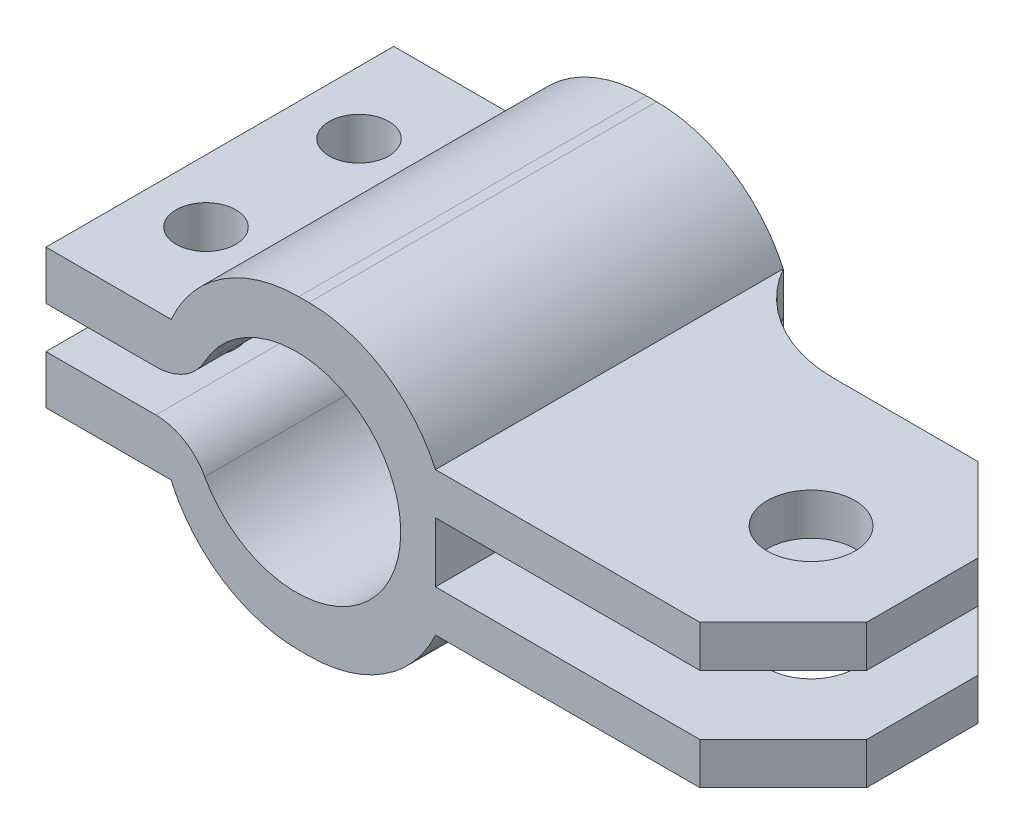
ISO-10303-21;
HEADER;
FILE_DESCRIPTION(('STEP AP214'),'2;1');
FILE_NAME('part.step','',(''),(''),'','','');
FILE_SCHEMA(('AUTOMOTIVE_DESIGN { 1 0 10303 214 1 1 1 1 }'));
ENDSEC;
DATA;
#1=APPLICATION_CONTEXT('core data for automotive mechanical design processes');
#2=APPLICATION_PROTOCOL_DEFINITION('international standard','automotive_design',2000,#1);
#3=PRODUCT_CONTEXT('',#1,'mechanical');
#4=PRODUCT('Part','Part','',(#3));
#5=PRODUCT_RELATED_PRODUCT_CATEGORY('part','',(#4));
#6=PRODUCT_DEFINITION_FORMATION('','',#4);
#7=PRODUCT_DEFINITION_CONTEXT('part definition',#1,'design');
#8=PRODUCT_DEFINITION('design','',#6,#7);
#9=PRODUCT_DEFINITION_SHAPE('','',#8);
#10=(LENGTH_UNIT() NAMED_UNIT(*) SI_UNIT(.MILLI.,.METRE.));
#11=(NAMED_UNIT(*) PLANE_ANGLE_UNIT() SI_UNIT($,.RADIAN.));
#12=(NAMED_UNIT(*) SI_UNIT($,.STERADIAN.) SOLID_ANGLE_UNIT());
#13=UNCERTAINTY_MEASURE_WITH_UNIT(LENGTH_MEASURE(1.E-05),#10,'distance_accuracy_value','');
#14=(GEOMETRIC_REPRESENTATION_CONTEXT(3) GLOBAL_UNCERTAINTY_ASSIGNED_CONTEXT((#13)) GLOBAL_UNIT_ASSIGNED_CONTEXT((#10,
#11,#12)) REPRESENTATION_CONTEXT('',''));
#15=CARTESIAN_POINT('',(0.,0.,0.));
#16=DIRECTION('',(0.,0.,1.));
#17=DIRECTION('',(1.,0.,0.));
#18=AXIS2_PLACEMENT_3D('',#15,#16,#17);
#19=CARTESIAN_POINT('',(12.5,-11.,25.));
#20=DIRECTION('',(-1.,0.,0.));
#21=DIRECTION('',(0.,0.,1.));
#22=AXIS2_PLACEMENT_3D('',#19,#20,#21);
#23=PLANE('',#22);
#24=DIRECTION('',(0.,0.,1.));
#25=VECTOR('',#24,1.);
#26=CARTESIAN_POINT('',(12.5,-2.15,25.));
#27=LINE('',#26,#25);
#28=CARTESIAN_POINT('',(12.5,-2.15,0.));
#29=VERTEX_POINT('',#28);
#30=CARTESIAN_POINT('',(12.5,-2.15,25.));
#31=VERTEX_POINT('',#30);
#32=EDGE_CURVE('E310',#29,#31,#27,.T.);
#33=ORIENTED_EDGE('',*,*,#32,.F.);
#34=DIRECTION('',(0.,1.,0.));
#35=VECTOR('',#34,1.);
#36=CARTESIAN_POINT('',(12.5,-11.,0.));
#37=LINE('',#36,#35);
#38=CARTESIAN_POINT('',(12.5,2.15,0.));
#39=VERTEX_POINT('',#38);
#40=EDGE_CURVE('E366',#29,#39,#37,.T.);
#41=ORIENTED_EDGE('',*,*,#40,.T.);
#42=DIRECTION('',(0.,0.,-1.));
#43=VECTOR('',#42,1.);
#44=CARTESIAN_POINT('',(12.5,2.15,25.));
#45=LINE('',#44,#43);
#46=CARTESIAN_POINT('',(12.5,2.15,25.));
#47=VERTEX_POINT('',#46);
#48=EDGE_CURVE('E325',#47,#39,#45,.T.);
#49=ORIENTED_EDGE('',*,*,#48,.F.);
#50=DIRECTION('',(0.,1.,0.));
#51=VECTOR('',#50,1.);
#52=CARTESIAN_POINT('',(12.5,-11.,25.));
#53=LINE('',#52,#51);
#54=EDGE_CURVE('E354',#31,#47,#53,.T.);
#55=ORIENTED_EDGE('',*,*,#54,.F.);
#56=EDGE_LOOP('',(#33,#41,#49,#55));
#57=FACE_BOUND('',#56,.T.);
#58=ADVANCED_FACE('F38',(#57),#23,.F.);
#59=CARTESIAN_POINT('',(0.,0.,25.));
#60=DIRECTION('',(0.,0.,1.));
#61=DIRECTION('',(1.,0.,0.));
#62=AXIS2_PLACEMENT_3D('',#59,#60,#61);
#63=PLANE('',#62);
#64=DIRECTION('',(-1.,0.,0.));
#65=VECTOR('',#64,1.);
#66=CARTESIAN_POINT('',(37.5,2.15,25.));
#67=LINE('',#66,#65);
#68=CARTESIAN_POINT('',(31.5,2.15,25.));
#69=VERTEX_POINT('',#68);
#70=EDGE_CURVE('E342',#69,#47,#67,.T.);
#71=ORIENTED_EDGE('',*,*,#70,.F.);
#72=DIRECTION('',(0.,1.,0.));
#73=VECTOR('',#72,1.);
#74=CARTESIAN_POINT('',(31.5,0.,25.));
#75=LINE('',#74,#73);
#76=CARTESIAN_POINT('',(31.5,5.15,25.));
#77=VERTEX_POINT('',#76);
#78=EDGE_CURVE('E11',#69,#77,#75,.T.);
#79=ORIENTED_EDGE('',*,*,#78,.T.);
#80=DIRECTION('',(-1.,0.,0.));
#81=VECTOR('',#80,1.);
#82=CARTESIAN_POINT('',(37.5,5.15,25.));
#83=LINE('',#82,#81);
#84=CARTESIAN_POINT('',(12.5,5.15,25.));
#85=VERTEX_POINT('',#84);
#86=EDGE_CURVE('E333',#77,#85,#83,.T.);
#87=ORIENTED_EDGE('',*,*,#86,.T.);
#88=CARTESIAN_POINT('',(3.40178588952754,1.,25.));
#89=DIRECTION('',(0.,0.,1.));
#90=DIRECTION('',(1.,0.,0.));
#91=AXIS2_PLACEMENT_3D('',#88,#89,#90);
#92=CIRCLE('',#91,10.);
#93=CARTESIAN_POINT('',(3.40178588952754,11.,25.));
#94=VERTEX_POINT('',#93);
#95=EDGE_CURVE('E413',#85,#94,#92,.T.);
#96=ORIENTED_EDGE('',*,*,#95,.T.);
#97=DIRECTION('',(-1.,0.,0.));
#98=VECTOR('',#97,1.);
#99=CARTESIAN_POINT('',(12.5,11.,25.));
#100=LINE('',#99,#98);
#101=CARTESIAN_POINT('',(2.66515138991167,11.,25.));
#102=VERTEX_POINT('',#101);
#103=EDGE_CURVE('E358',#94,#102,#100,.T.);
#104=ORIENTED_EDGE('',*,*,#103,.T.);
#105=CARTESIAN_POINT('',(2.66515138991168,1.,25.));
#106=DIRECTION('',(0.,0.,1.));
#107=DIRECTION('',(1.,0.,0.));
#108=AXIS2_PLACEMENT_3D('',#105,#106,#107);
#109=CIRCLE('',#108,10.);
#110=CARTESIAN_POINT('',(-6.50000000000001,5.,25.));
#111=VERTEX_POINT('',#110);
#112=EDGE_CURVE('E396',#102,#111,#109,.T.);
#113=ORIENTED_EDGE('',*,*,#112,.T.);
#114=DIRECTION('',(-1.,0.,0.));
#115=VECTOR('',#114,1.);
#116=CARTESIAN_POINT('',(-12.5,5.,25.));
#117=LINE('',#116,#115);
#118=CARTESIAN_POINT('',(-15.5,5.,25.));
#119=VERTEX_POINT('',#118);
#120=EDGE_CURVE('E281',#111,#119,#117,.T.);
#121=ORIENTED_EDGE('',*,*,#120,.T.);
#122=DIRECTION('',(0.,1.,0.));
#123=VECTOR('',#122,1.);
#124=CARTESIAN_POINT('',(-15.5,1.5,25.));
#125=LINE('',#124,#123);
#126=CARTESIAN_POINT('',(-15.5,1.5,25.));
#127=VERTEX_POINT('',#126);
#128=EDGE_CURVE('E272',#127,#119,#125,.T.);
#129=ORIENTED_EDGE('',*,*,#128,.F.);
#130=DIRECTION('',(1.,0.,0.));
#131=VECTOR('',#130,1.);
#132=CARTESIAN_POINT('',(-23.3579813214323,1.5,25.));
#133=LINE('',#132,#131);
#134=CARTESIAN_POINT('',(-7.59950493836208,1.5,25.));
#135=VERTEX_POINT('',#134);
#136=EDGE_CURVE('E237',#127,#135,#133,.T.);
#137=ORIENTED_EDGE('',*,*,#136,.T.);
#138=CARTESIAN_POINT('',(-7.59950493836208,5.5,25.));
#139=DIRECTION('',(0.,0.,1.));
#140=DIRECTION('',(1.,0.,0.));
#141=AXIS2_PLACEMENT_3D('',#138,#139,#140);
#142=CIRCLE('',#141,4.);
#143=CARTESIAN_POINT('',(-4.08663365545353,3.58695652173913,25.));
#144=VERTEX_POINT('',#143);
#145=EDGE_CURVE('E427',#135,#144,#142,.T.);
#146=ORIENTED_EDGE('',*,*,#145,.T.);
#147=CARTESIAN_POINT('',(2.5,0.,25.));
#148=DIRECTION('',(0.,0.,1.));
#149=DIRECTION('',(1.,0.,0.));
#150=AXIS2_PLACEMENT_3D('',#147,#148,#149);
#151=CIRCLE('',#150,7.5);
#152=CARTESIAN_POINT('',(-4.08663365545353,-3.58695652173913,25.));
#153=VERTEX_POINT('',#152);
#154=EDGE_CURVE('E345',#153,#144,#151,.T.);
#155=ORIENTED_EDGE('',*,*,#154,.F.);
#156=CARTESIAN_POINT('',(-7.59950493836208,-5.5,25.));
#157=DIRECTION('',(0.,0.,1.));
#158=DIRECTION('',(1.,0.,0.));
#159=AXIS2_PLACEMENT_3D('',#156,#157,#158);
#160=CIRCLE('',#159,4.);
#161=CARTESIAN_POINT('',(-7.59950493836208,-1.5,25.));
#162=VERTEX_POINT('',#161);
#163=EDGE_CURVE('E233',#153,#162,#160,.T.);
#164=ORIENTED_EDGE('',*,*,#163,.T.);
#165=DIRECTION('',(-1.,0.,0.));
#166=VECTOR('',#165,1.);
#167=CARTESIAN_POINT('',(-23.3579813214323,-1.5,25.));
#168=LINE('',#167,#166);
#169=CARTESIAN_POINT('',(-15.5,-1.5,25.));
#170=VERTEX_POINT('',#169);
#171=EDGE_CURVE('E224',#162,#170,#168,.T.);
#172=ORIENTED_EDGE('',*,*,#171,.T.);
#173=DIRECTION('',(0.,1.,0.));
#174=VECTOR('',#173,1.);
#175=CARTESIAN_POINT('',(-15.5,-5.,25.));
#176=LINE('',#175,#174);
#177=CARTESIAN_POINT('',(-15.5,-5.,25.));
#178=VERTEX_POINT('',#177);
#179=EDGE_CURVE('E230',#178,#170,#176,.T.);
#180=ORIENTED_EDGE('',*,*,#179,.F.);
#181=DIRECTION('',(1.,0.,0.));
#182=VECTOR('',#181,1.);
#183=CARTESIAN_POINT('',(-12.5,-5.,25.));
#184=LINE('',#183,#182);
#185=CARTESIAN_POINT('',(-6.50000000000001,-5.,25.));
#186=VERTEX_POINT('',#185);
#187=EDGE_CURVE('E290',#178,#186,#184,.T.);
#188=ORIENTED_EDGE('',*,*,#187,.T.);
#189=CARTESIAN_POINT('',(2.66515138991167,-0.999999999999999,25.));
#190=DIRECTION('',(0.,0.,1.));
#191=DIRECTION('',(1.,0.,0.));
#192=AXIS2_PLACEMENT_3D('',#189,#190,#191);
#193=CIRCLE('',#192,10.);
#194=CARTESIAN_POINT('',(2.66515138991167,-11.,25.));
#195=VERTEX_POINT('',#194);
#196=EDGE_CURVE('E398',#186,#195,#193,.T.);
#197=ORIENTED_EDGE('',*,*,#196,.T.);
#198=DIRECTION('',(1.,0.,0.));
#199=VECTOR('',#198,1.);
#200=CARTESIAN_POINT('',(12.5,-11.,25.));
#201=LINE('',#200,#199);
#202=CARTESIAN_POINT('',(3.40178588952755,-11.,25.));
#203=VERTEX_POINT('',#202);
#204=EDGE_CURVE('E351',#195,#203,#201,.T.);
#205=ORIENTED_EDGE('',*,*,#204,.T.);
#206=CARTESIAN_POINT('',(3.40178588952755,-0.999999999999999,25.));
#207=DIRECTION('',(0.,0.,1.));
#208=DIRECTION('',(1.,0.,0.));
#209=AXIS2_PLACEMENT_3D('',#206,#207,#208);
#210=CIRCLE('',#209,10.);
#211=CARTESIAN_POINT('',(12.5,-5.15,25.));
#212=VERTEX_POINT('',#211);
#213=EDGE_CURVE('E410',#203,#212,#210,.T.);
#214=ORIENTED_EDGE('',*,*,#213,.T.);
#215=DIRECTION('',(-1.,0.,0.));
#216=VECTOR('',#215,1.);
#217=CARTESIAN_POINT('',(37.5,-5.15,25.));
#218=LINE('',#217,#216);
#219=CARTESIAN_POINT('',(31.5,-5.15,25.));
#220=VERTEX_POINT('',#219);
#221=EDGE_CURVE('E323',#220,#212,#218,.T.);
#222=ORIENTED_EDGE('',*,*,#221,.F.);
#223=DIRECTION('',(0.,1.,0.));
#224=VECTOR('',#223,1.);
#225=CARTESIAN_POINT('',(31.5,0.,25.));
#226=LINE('',#225,#224);
#227=CARTESIAN_POINT('',(31.5,-2.15,25.));
#228=VERTEX_POINT('',#227);
#229=EDGE_CURVE('E47',#220,#228,#226,.T.);
#230=ORIENTED_EDGE('',*,*,#229,.T.);
#231=DIRECTION('',(-1.,0.,0.));
#232=VECTOR('',#231,1.);
#233=CARTESIAN_POINT('',(37.5,-2.15,25.));
#234=LINE('',#233,#232);
#235=EDGE_CURVE('E313',#228,#31,#234,.T.);
#236=ORIENTED_EDGE('',*,*,#235,.T.);
#237=ORIENTED_EDGE('',*,*,#54,.T.);
#238=EDGE_LOOP('',(#71,#79,#87,#96,#104,#113,#121,#129,#137,#146,#155,#164,#172,#180,#188,#197,
#205,#214,#222,#230,#236,#237));
#239=FACE_BOUND('',#238,.T.);
#240=ADVANCED_FACE('F227',(#239),#63,.T.);
#241=CARTESIAN_POINT('',(0.,0.,0.));
#242=DIRECTION('',(0.,0.,1.));
#243=DIRECTION('',(1.,0.,0.));
#244=AXIS2_PLACEMENT_3D('',#241,#242,#243);
#245=PLANE('',#244);
#246=DIRECTION('',(-1.,0.,0.));
#247=VECTOR('',#246,1.);
#248=CARTESIAN_POINT('',(-23.3579813214323,-1.5,0.));
#249=LINE('',#248,#247);
#250=CARTESIAN_POINT('',(-7.59950493836208,-1.5,0.));
#251=VERTEX_POINT('',#250);
#252=CARTESIAN_POINT('',(-15.5,-1.5,0.));
#253=VERTEX_POINT('',#252);
#254=EDGE_CURVE('E244',#251,#253,#249,.T.);
#255=ORIENTED_EDGE('',*,*,#254,.F.);
#256=CARTESIAN_POINT('',(-7.59950493836208,-5.5,0.));
#257=DIRECTION('',(0.,0.,1.));
#258=DIRECTION('',(1.,0.,0.));
#259=AXIS2_PLACEMENT_3D('',#256,#257,#258);
#260=CIRCLE('',#259,4.);
#261=CARTESIAN_POINT('',(-4.08663365545353,-3.58695652173913,0.));
#262=VERTEX_POINT('',#261);
#263=EDGE_CURVE('E421',#251,#262,#260,.F.);
#264=ORIENTED_EDGE('',*,*,#263,.T.);
#265=CARTESIAN_POINT('',(2.5,0.,0.));
#266=DIRECTION('',(0.,0.,1.));
#267=DIRECTION('',(1.,0.,0.));
#268=AXIS2_PLACEMENT_3D('',#265,#266,#267);
#269=CIRCLE('',#268,7.5);
#270=CARTESIAN_POINT('',(-4.08663365545353,3.58695652173913,0.));
#271=VERTEX_POINT('',#270);
#272=EDGE_CURVE('E344',#262,#271,#269,.T.);
#273=ORIENTED_EDGE('',*,*,#272,.T.);
#274=CARTESIAN_POINT('',(-7.59950493836208,5.5,0.));
#275=DIRECTION('',(0.,0.,1.));
#276=DIRECTION('',(1.,0.,0.));
#277=AXIS2_PLACEMENT_3D('',#274,#275,#276);
#278=CIRCLE('',#277,4.);
#279=CARTESIAN_POINT('',(-7.59950493836208,1.5,0.));
#280=VERTEX_POINT('',#279);
#281=EDGE_CURVE('E419',#271,#280,#278,.F.);
#282=ORIENTED_EDGE('',*,*,#281,.T.);
#283=DIRECTION('',(1.,0.,0.));
#284=VECTOR('',#283,1.);
#285=CARTESIAN_POINT('',(-23.3579813214323,1.5,0.));
#286=LINE('',#285,#284);
#287=CARTESIAN_POINT('',(-15.5,1.5,0.));
#288=VERTEX_POINT('',#287);
#289=EDGE_CURVE('E238',#288,#280,#286,.T.);
#290=ORIENTED_EDGE('',*,*,#289,.F.);
#291=DIRECTION('',(0.,-1.,0.));
#292=VECTOR('',#291,1.);
#293=CARTESIAN_POINT('',(-15.5,5.,0.));
#294=LINE('',#293,#292);
#295=CARTESIAN_POINT('',(-15.5,5.,0.));
#296=VERTEX_POINT('',#295);
#297=EDGE_CURVE('E266',#296,#288,#294,.T.);
#298=ORIENTED_EDGE('',*,*,#297,.F.);
#299=DIRECTION('',(-1.,0.,0.));
#300=VECTOR('',#299,1.);
#301=CARTESIAN_POINT('',(-12.5,5.,0.));
#302=LINE('',#301,#300);
#303=CARTESIAN_POINT('',(-6.50000000000001,5.,0.));
#304=VERTEX_POINT('',#303);
#305=EDGE_CURVE('E284',#304,#296,#302,.T.);
#306=ORIENTED_EDGE('',*,*,#305,.F.);
#307=CARTESIAN_POINT('',(2.66515138991168,1.,0.));
#308=DIRECTION('',(0.,0.,1.));
#309=DIRECTION('',(1.,0.,0.));
#310=AXIS2_PLACEMENT_3D('',#307,#308,#309);
#311=CIRCLE('',#310,10.);
#312=CARTESIAN_POINT('',(2.66515138991167,11.,0.));
#313=VERTEX_POINT('',#312);
#314=EDGE_CURVE('E391',#304,#313,#311,.F.);
#315=ORIENTED_EDGE('',*,*,#314,.T.);
#316=DIRECTION('',(-1.,0.,0.));
#317=VECTOR('',#316,1.);
#318=CARTESIAN_POINT('',(12.5,11.,0.));
#319=LINE('',#318,#317);
#320=CARTESIAN_POINT('',(3.40178588952754,11.,0.));
#321=VERTEX_POINT('',#320);
#322=EDGE_CURVE('E355',#321,#313,#319,.T.);
#323=ORIENTED_EDGE('',*,*,#322,.F.);
#324=CARTESIAN_POINT('',(3.40178588952754,1.,0.));
#325=DIRECTION('',(0.,0.,1.));
#326=DIRECTION('',(1.,0.,0.));
#327=AXIS2_PLACEMENT_3D('',#324,#325,#326);
#328=CIRCLE('',#327,10.);
#329=CARTESIAN_POINT('',(12.5,5.15,0.));
#330=VERTEX_POINT('',#329);
#331=EDGE_CURVE('E408',#321,#330,#328,.F.);
#332=ORIENTED_EDGE('',*,*,#331,.T.);
#333=EDGE_CURVE('E363',#39,#330,#37,.T.);
#334=ORIENTED_EDGE('',*,*,#333,.F.);
#335=ORIENTED_EDGE('',*,*,#40,.F.);
#336=CARTESIAN_POINT('',(12.5,-5.15,0.));
#337=VERTEX_POINT('',#336);
#338=EDGE_CURVE('E367',#337,#29,#37,.T.);
#339=ORIENTED_EDGE('',*,*,#338,.F.);
#340=CARTESIAN_POINT('',(3.40178588952755,-0.999999999999999,0.));
#341=DIRECTION('',(0.,0.,1.));
#342=DIRECTION('',(1.,0.,0.));
#343=AXIS2_PLACEMENT_3D('',#340,#341,#342);
#344=CIRCLE('',#343,10.);
#345=CARTESIAN_POINT('',(3.40178588952755,-11.,0.));
#346=VERTEX_POINT('',#345);
#347=EDGE_CURVE('E406',#337,#346,#344,.F.);
#348=ORIENTED_EDGE('',*,*,#347,.T.);
#349=DIRECTION('',(1.,0.,0.));
#350=VECTOR('',#349,1.);
#351=CARTESIAN_POINT('',(12.5,-11.,0.));
#352=LINE('',#351,#350);
#353=CARTESIAN_POINT('',(2.66515138991167,-11.,0.));
#354=VERTEX_POINT('',#353);
#355=EDGE_CURVE('E348',#354,#346,#352,.T.);
#356=ORIENTED_EDGE('',*,*,#355,.F.);
#357=CARTESIAN_POINT('',(2.66515138991167,-0.999999999999999,0.));
#358=DIRECTION('',(0.,0.,1.));
#359=DIRECTION('',(1.,0.,0.));
#360=AXIS2_PLACEMENT_3D('',#357,#358,#359);
#361=CIRCLE('',#360,10.);
#362=CARTESIAN_POINT('',(-6.50000000000001,-5.,0.));
#363=VERTEX_POINT('',#362);
#364=EDGE_CURVE('E394',#354,#363,#361,.F.);
#365=ORIENTED_EDGE('',*,*,#364,.T.);
#366=DIRECTION('',(1.,0.,0.));
#367=VECTOR('',#366,1.);
#368=CARTESIAN_POINT('',(-12.5,-5.,0.));
#369=LINE('',#368,#367);
#370=CARTESIAN_POINT('',(-15.5,-5.,0.));
#371=VERTEX_POINT('',#370);
#372=EDGE_CURVE('E277',#371,#363,#369,.T.);
#373=ORIENTED_EDGE('',*,*,#372,.F.);
#374=DIRECTION('',(0.,-1.,0.));
#375=VECTOR('',#374,1.);
#376=CARTESIAN_POINT('',(-15.5,-1.5,0.));
#377=LINE('',#376,#375);
#378=EDGE_CURVE('E248',#253,#371,#377,.T.);
#379=ORIENTED_EDGE('',*,*,#378,.F.);
#380=EDGE_LOOP('',(#255,#264,#273,#282,#290,#298,#306,#315,#323,#332,#334,#335,#339,#348,#356,
#365,#373,#379));
#381=FACE_BOUND('',#380,.T.);
#382=ADVANCED_FACE('F499',(#381),#245,.F.);
#383=CARTESIAN_POINT('',(12.5,-11.,25.));
#384=DIRECTION('',(0.,1.,0.));
#385=DIRECTION('',(-1.,0.,0.));
#386=AXIS2_PLACEMENT_3D('',#383,#384,#385);
#387=PLANE('',#386);
#388=ORIENTED_EDGE('',*,*,#355,.T.);
#389=DIRECTION('',(0.,0.,-1.));
#390=VECTOR('',#389,1.);
#391=CARTESIAN_POINT('',(3.40178588952755,-11.,25.));
#392=LINE('',#391,#390);
#393=EDGE_CURVE('E415',#346,#203,#392,.F.);
#394=ORIENTED_EDGE('',*,*,#393,.T.);
#395=ORIENTED_EDGE('',*,*,#204,.F.);
#396=DIRECTION('',(0.,0.,1.));
#397=VECTOR('',#396,1.);
#398=CARTESIAN_POINT('',(2.66515138991167,-11.,25.));
#399=LINE('',#398,#397);
#400=EDGE_CURVE('E388',#195,#354,#399,.F.);
#401=ORIENTED_EDGE('',*,*,#400,.T.);
#402=EDGE_LOOP('',(#388,#394,#395,#401));
#403=FACE_BOUND('',#402,.T.);
#404=ADVANCED_FACE('F552',(#403),#387,.F.);
#405=CARTESIAN_POINT('',(12.5,11.,25.));
#406=DIRECTION('',(0.,-1.,0.));
#407=DIRECTION('',(1.,0.,0.));
#408=AXIS2_PLACEMENT_3D('',#405,#406,#407);
#409=PLANE('',#408);
#410=ORIENTED_EDGE('',*,*,#103,.F.);
#411=DIRECTION('',(0.,0.,1.));
#412=VECTOR('',#411,1.);
#413=CARTESIAN_POINT('',(3.40178588952754,11.,25.));
#414=LINE('',#413,#412);
#415=EDGE_CURVE('E403',#94,#321,#414,.F.);
#416=ORIENTED_EDGE('',*,*,#415,.T.);
#417=ORIENTED_EDGE('',*,*,#322,.T.);
#418=DIRECTION('',(0.,0.,-1.));
#419=VECTOR('',#418,1.);
#420=CARTESIAN_POINT('',(2.66515138991167,11.,25.));
#421=LINE('',#420,#419);
#422=EDGE_CURVE('E400',#313,#102,#421,.F.);
#423=ORIENTED_EDGE('',*,*,#422,.T.);
#424=EDGE_LOOP('',(#410,#416,#417,#423));
#425=FACE_BOUND('',#424,.T.);
#426=ADVANCED_FACE('F550',(#425),#409,.F.);
#427=CARTESIAN_POINT('',(2.5,0.,25.));
#428=DIRECTION('',(0.,0.,-1.));
#429=DIRECTION('',(-1.,0.,0.));
#430=AXIS2_PLACEMENT_3D('',#427,#428,#429);
#431=CYLINDRICAL_SURFACE('',#430,7.5);
#432=ORIENTED_EDGE('',*,*,#272,.F.);
#433=DIRECTION('',(0.,0.,-1.));
#434=VECTOR('',#433,1.);
#435=CARTESIAN_POINT('',(-4.08663365545353,-3.58695652173913,25.));
#436=LINE('',#435,#434);
#437=EDGE_CURVE('E425',#262,#153,#436,.F.);
#438=ORIENTED_EDGE('',*,*,#437,.T.);
#439=ORIENTED_EDGE('',*,*,#154,.T.);
#440=DIRECTION('',(0.,0.,-1.));
#441=VECTOR('',#440,1.);
#442=CARTESIAN_POINT('',(-4.08663365545353,3.58695652173913,25.));
#443=LINE('',#442,#441);
#444=EDGE_CURVE('E423',#144,#271,#443,.T.);
#445=ORIENTED_EDGE('',*,*,#444,.T.);
#446=EDGE_LOOP('',(#432,#438,#439,#445));
#447=FACE_BOUND('',#446,.T.);
#448=ADVANCED_FACE('F539',(#447),#431,.F.);
#449=CARTESIAN_POINT('',(37.5,2.15,25.));
#450=DIRECTION('',(0.,1.,0.));
#451=DIRECTION('',(0.,0.,1.));
#452=AXIS2_PLACEMENT_3D('',#449,#450,#451);
#453=PLANE('',#452);
#454=CARTESIAN_POINT('',(29.5,2.15,15.));
#455=DIRECTION('',(0.,1.,0.));
#456=DIRECTION('',(0.,0.,1.));
#457=AXIS2_PLACEMENT_3D('',#454,#455,#456);
#458=CIRCLE('',#457,3.15);
#459=CARTESIAN_POINT('',(29.5,2.15,18.15));
#460=VERTEX_POINT('',#459);
#461=EDGE_CURVE('E302',#460,#460,#458,.T.);
#462=ORIENTED_EDGE('',*,*,#461,.T.);
#463=EDGE_LOOP('',(#462));
#464=FACE_BOUND('',#463,.T.);
#465=DIRECTION('',(-1.,0.,0.));
#466=VECTOR('',#465,1.);
#467=CARTESIAN_POINT('',(37.5,2.15,5.));
#468=LINE('',#467,#466);
#469=CARTESIAN_POINT('',(31.5,2.15,5.));
#470=VERTEX_POINT('',#469);
#471=CARTESIAN_POINT('',(21.1602540378444,2.15,5.));
#472=VERTEX_POINT('',#471);
#473=EDGE_CURVE('E340',#470,#472,#468,.T.);
#474=ORIENTED_EDGE('',*,*,#473,.F.);
#475=DIRECTION('',(0.707106781186549,0.,0.707106781186546));
#476=VECTOR('',#475,1.);
#477=CARTESIAN_POINT('',(37.5,2.15,11.));
#478=LINE('',#477,#476);
#479=CARTESIAN_POINT('',(37.5,2.15,11.));
#480=VERTEX_POINT('',#479);
#481=EDGE_CURVE('E456',#470,#480,#478,.T.);
#482=ORIENTED_EDGE('',*,*,#481,.T.);
#483=DIRECTION('',(0.,0.,-1.));
#484=VECTOR('',#483,1.);
#485=CARTESIAN_POINT('',(37.5,2.15,25.));
#486=LINE('',#485,#484);
#487=CARTESIAN_POINT('',(37.5,2.15,19.));
#488=VERTEX_POINT('',#487);
#489=EDGE_CURVE('E326',#488,#480,#486,.T.);
#490=ORIENTED_EDGE('',*,*,#489,.F.);
#491=DIRECTION('',(0.707106781186549,0.,-0.707106781186546));
#492=VECTOR('',#491,1.);
#493=CARTESIAN_POINT('',(37.5,2.15,19.));
#494=LINE('',#493,#492);
#495=EDGE_CURVE('E454',#488,#69,#494,.F.);
#496=ORIENTED_EDGE('',*,*,#495,.T.);
#497=ORIENTED_EDGE('',*,*,#70,.T.);
#498=ORIENTED_EDGE('',*,*,#48,.T.);
#499=CARTESIAN_POINT('',(21.1602540378444,2.15,-5.));
#500=DIRECTION('',(0.,1.,0.));
#501=DIRECTION('',(0.,0.,1.));
#502=AXIS2_PLACEMENT_3D('',#499,#500,#501);
#503=CIRCLE('',#502,10.);
#504=EDGE_CURVE('E385',#39,#472,#503,.T.);
#505=ORIENTED_EDGE('',*,*,#504,.T.);
#506=EDGE_LOOP('',(#474,#482,#490,#496,#497,#498,#505));
#507=FACE_BOUND('',#506,.T.);
#508=ADVANCED_FACE('F510',(#464,#507),#453,.F.);
#509=CARTESIAN_POINT('',(37.5,5.15,5.));
#510=DIRECTION('',(0.,0.,1.));
#511=DIRECTION('',(0.,-1.,0.));
#512=AXIS2_PLACEMENT_3D('',#509,#510,#511);
#513=PLANE('',#512);
#514=DIRECTION('',(-1.,0.,0.));
#515=VECTOR('',#514,1.);
#516=CARTESIAN_POINT('',(37.5,5.15,5.));
#517=LINE('',#516,#515);
#518=CARTESIAN_POINT('',(31.5,5.15,5.));
#519=VERTEX_POINT('',#518);
#520=CARTESIAN_POINT('',(21.1602540378444,5.15,5.));
#521=VERTEX_POINT('',#520);
#522=EDGE_CURVE('E338',#519,#521,#517,.T.);
#523=ORIENTED_EDGE('',*,*,#522,.F.);
#524=DIRECTION('',(0.,-1.,0.));
#525=VECTOR('',#524,1.);
#526=CARTESIAN_POINT('',(31.5,2.15,5.));
#527=LINE('',#526,#525);
#528=EDGE_CURVE('E452',#519,#470,#527,.T.);
#529=ORIENTED_EDGE('',*,*,#528,.T.);
#530=ORIENTED_EDGE('',*,*,#473,.T.);
#531=DIRECTION('',(0.,1.,0.));
#532=VECTOR('',#531,1.);
#533=CARTESIAN_POINT('',(21.1602540378444,5.15,5.));
#534=LINE('',#533,#532);
#535=EDGE_CURVE('E373',#472,#521,#534,.T.);
#536=ORIENTED_EDGE('',*,*,#535,.T.);
#537=EDGE_LOOP('',(#523,#529,#530,#536));
#538=FACE_BOUND('',#537,.T.);
#539=ADVANCED_FACE('F530',(#538),#513,.F.);
#540=CARTESIAN_POINT('',(37.5,5.15,25.));
#541=DIRECTION('',(0.,-1.,0.));
#542=DIRECTION('',(0.,0.,-1.));
#543=AXIS2_PLACEMENT_3D('',#540,#541,#542);
#544=PLANE('',#543);
#545=CARTESIAN_POINT('',(29.5,5.15,15.));
#546=DIRECTION('',(0.,1.,0.));
#547=DIRECTION('',(0.,0.,1.));
#548=AXIS2_PLACEMENT_3D('',#545,#546,#547);
#549=CIRCLE('',#548,3.15);
#550=CARTESIAN_POINT('',(29.5,5.15,18.15));
#551=VERTEX_POINT('',#550);
#552=EDGE_CURVE('E289',#551,#551,#549,.T.);
#553=ORIENTED_EDGE('',*,*,#552,.F.);
#554=EDGE_LOOP('',(#553));
#555=FACE_BOUND('',#554,.T.);
#556=DIRECTION('',(0.,0.,1.));
#557=VECTOR('',#556,1.);
#558=CARTESIAN_POINT('',(37.5,5.15,25.));
#559=LINE('',#558,#557);
#560=CARTESIAN_POINT('',(37.5,5.15,11.));
#561=VERTEX_POINT('',#560);
#562=CARTESIAN_POINT('',(37.5,5.15,19.));
#563=VERTEX_POINT('',#562);
#564=EDGE_CURVE('E329',#561,#563,#559,.T.);
#565=ORIENTED_EDGE('',*,*,#564,.F.);
#566=DIRECTION('',(-0.707106781186549,0.,-0.707106781186546));
#567=VECTOR('',#566,1.);
#568=CARTESIAN_POINT('',(37.5,5.15,11.));
#569=LINE('',#568,#567);
#570=EDGE_CURVE('E450',#561,#519,#569,.T.);
#571=ORIENTED_EDGE('',*,*,#570,.T.);
#572=ORIENTED_EDGE('',*,*,#522,.T.);
#573=CARTESIAN_POINT('',(21.1602540378444,5.15,-5.));
#574=DIRECTION('',(0.,-1.,0.));
#575=DIRECTION('',(0.,0.,-1.));
#576=AXIS2_PLACEMENT_3D('',#573,#574,#575);
#577=CIRCLE('',#576,10.);
#578=EDGE_CURVE('E382',#521,#330,#577,.T.);
#579=ORIENTED_EDGE('',*,*,#578,.T.);
#580=DIRECTION('',(0.,0.,1.));
#581=VECTOR('',#580,1.);
#582=CARTESIAN_POINT('',(12.5,5.15,25.));
#583=LINE('',#582,#581);
#584=EDGE_CURVE('E330',#330,#85,#583,.T.);
#585=ORIENTED_EDGE('',*,*,#584,.T.);
#586=ORIENTED_EDGE('',*,*,#86,.F.);
#587=DIRECTION('',(-0.707106781186549,0.,0.707106781186546));
#588=VECTOR('',#587,1.);
#589=CARTESIAN_POINT('',(37.5,5.15,19.));
#590=LINE('',#589,#588);
#591=EDGE_CURVE('E448',#77,#563,#590,.F.);
#592=ORIENTED_EDGE('',*,*,#591,.T.);
#593=EDGE_LOOP('',(#565,#571,#572,#579,#585,#586,#592));
#594=FACE_BOUND('',#593,.T.);
#595=ADVANCED_FACE('F521',(#555,#594),#544,.F.);
#596=CARTESIAN_POINT('',(37.5,0.,0.));
#597=DIRECTION('',(1.,0.,0.));
#598=DIRECTION('',(0.,0.,-1.));
#599=AXIS2_PLACEMENT_3D('',#596,#597,#598);
#600=PLANE('',#599);
#601=ORIENTED_EDGE('',*,*,#489,.T.);
#602=DIRECTION('',(0.,1.,0.));
#603=VECTOR('',#602,1.);
#604=CARTESIAN_POINT('',(37.5,5.15,11.));
#605=LINE('',#604,#603);
#606=EDGE_CURVE('E445',#480,#561,#605,.T.);
#607=ORIENTED_EDGE('',*,*,#606,.T.);
#608=ORIENTED_EDGE('',*,*,#564,.T.);
#609=DIRECTION('',(0.,-1.,0.));
#610=VECTOR('',#609,1.);
#611=CARTESIAN_POINT('',(37.5,0.,19.));
#612=LINE('',#611,#610);
#613=EDGE_CURVE('E433',#563,#488,#612,.T.);
#614=ORIENTED_EDGE('',*,*,#613,.T.);
#615=EDGE_LOOP('',(#601,#607,#608,#614));
#616=FACE_BOUND('',#615,.T.);
#617=ADVANCED_FACE('F523',(#616),#600,.T.);
#618=CARTESIAN_POINT('',(37.5,-5.15,25.));
#619=DIRECTION('',(0.,1.,0.));
#620=DIRECTION('',(0.,0.,1.));
#621=AXIS2_PLACEMENT_3D('',#618,#619,#620);
#622=PLANE('',#621);
#623=CARTESIAN_POINT('',(29.5,-5.15,15.));
#624=DIRECTION('',(0.,1.,0.));
#625=DIRECTION('',(0.,0.,1.));
#626=AXIS2_PLACEMENT_3D('',#623,#624,#625);
#627=CIRCLE('',#626,3.15);
#628=CARTESIAN_POINT('',(29.5,-5.15,18.15));
#629=VERTEX_POINT('',#628);
#630=EDGE_CURVE('E299',#629,#629,#627,.T.);
#631=ORIENTED_EDGE('',*,*,#630,.T.);
#632=EDGE_LOOP('',(#631));
#633=FACE_BOUND('',#632,.T.);
#634=DIRECTION('',(-1.,0.,0.));
#635=VECTOR('',#634,1.);
#636=CARTESIAN_POINT('',(37.5,-5.15,5.));
#637=LINE('',#636,#635);
#638=CARTESIAN_POINT('',(31.5,-5.15,5.));
#639=VERTEX_POINT('',#638);
#640=CARTESIAN_POINT('',(21.1602540378444,-5.15,5.));
#641=VERTEX_POINT('',#640);
#642=EDGE_CURVE('E321',#639,#641,#637,.T.);
#643=ORIENTED_EDGE('',*,*,#642,.F.);
#644=DIRECTION('',(0.707106781186549,0.,0.707106781186546));
#645=VECTOR('',#644,1.);
#646=CARTESIAN_POINT('',(37.5,-5.15,11.));
#647=LINE('',#646,#645);
#648=CARTESIAN_POINT('',(37.5,-5.15,11.));
#649=VERTEX_POINT('',#648);
#650=EDGE_CURVE('E470',#639,#649,#647,.T.);
#651=ORIENTED_EDGE('',*,*,#650,.T.);
#652=DIRECTION('',(0.,0.,-1.));
#653=VECTOR('',#652,1.);
#654=CARTESIAN_POINT('',(37.5,-5.15,25.));
#655=LINE('',#654,#653);
#656=CARTESIAN_POINT('',(37.5,-5.15,19.));
#657=VERTEX_POINT('',#656);
#658=EDGE_CURVE('E306',#657,#649,#655,.T.);
#659=ORIENTED_EDGE('',*,*,#658,.F.);
#660=DIRECTION('',(0.707106781186549,0.,-0.707106781186546));
#661=VECTOR('',#660,1.);
#662=CARTESIAN_POINT('',(37.5,-5.15,19.));
#663=LINE('',#662,#661);
#664=EDGE_CURVE('E54',#657,#220,#663,.F.);
#665=ORIENTED_EDGE('',*,*,#664,.T.);
#666=ORIENTED_EDGE('',*,*,#221,.T.);
#667=DIRECTION('',(0.,0.,-1.));
#668=VECTOR('',#667,1.);
#669=CARTESIAN_POINT('',(12.5,-5.15,25.));
#670=LINE('',#669,#668);
#671=EDGE_CURVE('E305',#212,#337,#670,.T.);
#672=ORIENTED_EDGE('',*,*,#671,.T.);
#673=CARTESIAN_POINT('',(21.1602540378444,-5.15,-5.));
#674=DIRECTION('',(0.,1.,0.));
#675=DIRECTION('',(0.,0.,1.));
#676=AXIS2_PLACEMENT_3D('',#673,#674,#675);
#677=CIRCLE('',#676,10.);
#678=EDGE_CURVE('E379',#337,#641,#677,.T.);
#679=ORIENTED_EDGE('',*,*,#678,.T.);
#680=EDGE_LOOP('',(#643,#651,#659,#665,#666,#672,#679));
#681=FACE_BOUND('',#680,.T.);
#682=ADVANCED_FACE('F483',(#633,#681),#622,.F.);
#683=CARTESIAN_POINT('',(37.5,-2.15,5.));
#684=DIRECTION('',(0.,0.,1.));
#685=DIRECTION('',(1.,0.,0.));
#686=AXIS2_PLACEMENT_3D('',#683,#684,#685);
#687=PLANE('',#686);
#688=DIRECTION('',(-1.,0.,0.));
#689=VECTOR('',#688,1.);
#690=CARTESIAN_POINT('',(37.5,-2.15,5.));
#691=LINE('',#690,#689);
#692=CARTESIAN_POINT('',(31.5,-2.15,5.));
#693=VERTEX_POINT('',#692);
#694=CARTESIAN_POINT('',(21.1602540378444,-2.15,5.));
#695=VERTEX_POINT('',#694);
#696=EDGE_CURVE('E319',#693,#695,#691,.T.);
#697=ORIENTED_EDGE('',*,*,#696,.F.);
#698=DIRECTION('',(0.,-1.,0.));
#699=VECTOR('',#698,1.);
#700=CARTESIAN_POINT('',(31.5,-5.15,5.));
#701=LINE('',#700,#699);
#702=EDGE_CURVE('E62',#693,#639,#701,.T.);
#703=ORIENTED_EDGE('',*,*,#702,.T.);
#704=ORIENTED_EDGE('',*,*,#642,.T.);
#705=DIRECTION('',(0.,1.,0.));
#706=VECTOR('',#705,1.);
#707=CARTESIAN_POINT('',(21.1602540378444,-2.15,5.));
#708=LINE('',#707,#706);
#709=EDGE_CURVE('E360',#641,#695,#708,.T.);
#710=ORIENTED_EDGE('',*,*,#709,.T.);
#711=EDGE_LOOP('',(#697,#703,#704,#710));
#712=FACE_BOUND('',#711,.T.);
#713=ADVANCED_FACE('F488',(#712),#687,.F.);
#714=CARTESIAN_POINT('',(37.5,-2.15,25.));
#715=DIRECTION('',(0.,-1.,0.));
#716=DIRECTION('',(0.,0.,-1.));
#717=AXIS2_PLACEMENT_3D('',#714,#715,#716);
#718=PLANE('',#717);
#719=CARTESIAN_POINT('',(29.5,-2.15,15.));
#720=DIRECTION('',(0.,-1.,0.));
#721=DIRECTION('',(0.,0.,-1.));
#722=AXIS2_PLACEMENT_3D('',#719,#720,#721);
#723=CIRCLE('',#722,3.15);
#724=CARTESIAN_POINT('',(29.5,-2.15,11.85));
#725=VERTEX_POINT('',#724);
#726=EDGE_CURVE('E298',#725,#725,#723,.T.);
#727=ORIENTED_EDGE('',*,*,#726,.T.);
#728=EDGE_LOOP('',(#727));
#729=FACE_BOUND('',#728,.T.);
#730=DIRECTION('',(0.,0.,1.));
#731=VECTOR('',#730,1.);
#732=CARTESIAN_POINT('',(37.5,-2.15,25.));
#733=LINE('',#732,#731);
#734=CARTESIAN_POINT('',(37.5,-2.15,11.));
#735=VERTEX_POINT('',#734);
#736=CARTESIAN_POINT('',(37.5,-2.15,19.));
#737=VERTEX_POINT('',#736);
#738=EDGE_CURVE('E309',#735,#737,#733,.T.);
#739=ORIENTED_EDGE('',*,*,#738,.F.);
#740=DIRECTION('',(-0.707106781186549,0.,-0.707106781186546));
#741=VECTOR('',#740,1.);
#742=CARTESIAN_POINT('',(37.5,-2.15,11.));
#743=LINE('',#742,#741);
#744=EDGE_CURVE('E466',#735,#693,#743,.T.);
#745=ORIENTED_EDGE('',*,*,#744,.T.);
#746=ORIENTED_EDGE('',*,*,#696,.T.);
#747=CARTESIAN_POINT('',(21.1602540378444,-2.15,-5.));
#748=DIRECTION('',(0.,-1.,0.));
#749=DIRECTION('',(0.,0.,-1.));
#750=AXIS2_PLACEMENT_3D('',#747,#748,#749);
#751=CIRCLE('',#750,10.);
#752=EDGE_CURVE('E376',#695,#29,#751,.T.);
#753=ORIENTED_EDGE('',*,*,#752,.T.);
#754=ORIENTED_EDGE('',*,*,#32,.T.);
#755=ORIENTED_EDGE('',*,*,#235,.F.);
#756=DIRECTION('',(-0.707106781186549,0.,0.707106781186546));
#757=VECTOR('',#756,1.);
#758=CARTESIAN_POINT('',(37.5,-2.15,19.));
#759=LINE('',#758,#757);
#760=EDGE_CURVE('E464',#228,#737,#759,.F.);
#761=ORIENTED_EDGE('',*,*,#760,.T.);
#762=EDGE_LOOP('',(#739,#745,#746,#753,#754,#755,#761));
#763=FACE_BOUND('',#762,.T.);
#764=ADVANCED_FACE('F477',(#729,#763),#718,.F.);
#765=CARTESIAN_POINT('',(37.5,0.,0.));
#766=DIRECTION('',(1.,0.,0.));
#767=DIRECTION('',(0.,0.,-1.));
#768=AXIS2_PLACEMENT_3D('',#765,#766,#767);
#769=PLANE('',#768);
#770=ORIENTED_EDGE('',*,*,#658,.T.);
#771=DIRECTION('',(0.,1.,0.));
#772=VECTOR('',#771,1.);
#773=CARTESIAN_POINT('',(37.5,-2.15,11.));
#774=LINE('',#773,#772);
#775=EDGE_CURVE('E461',#649,#735,#774,.T.);
#776=ORIENTED_EDGE('',*,*,#775,.T.);
#777=ORIENTED_EDGE('',*,*,#738,.T.);
#778=DIRECTION('',(0.,-1.,0.));
#779=VECTOR('',#778,1.);
#780=CARTESIAN_POINT('',(37.5,0.,19.));
#781=LINE('',#780,#779);
#782=EDGE_CURVE('E458',#737,#657,#781,.T.);
#783=ORIENTED_EDGE('',*,*,#782,.T.);
#784=EDGE_LOOP('',(#770,#776,#777,#783));
#785=FACE_BOUND('',#784,.T.);
#786=ADVANCED_FACE('F481',(#785),#769,.T.);
#787=CARTESIAN_POINT('',(29.5,-19.85,15.));
#788=DIRECTION('',(0.,1.,0.));
#789=DIRECTION('',(0.,0.,1.));
#790=AXIS2_PLACEMENT_3D('',#787,#788,#789);
#791=CYLINDRICAL_SURFACE('',#790,3.15);
#792=ORIENTED_EDGE('',*,*,#726,.F.);
#793=EDGE_LOOP('',(#792));
#794=FACE_BOUND('',#793,.T.);
#795=ORIENTED_EDGE('',*,*,#630,.F.);
#796=EDGE_LOOP('',(#795));
#797=FACE_BOUND('',#796,.T.);
#798=ADVANCED_FACE('F635',(#794,#797),#791,.F.);
#799=ORIENTED_EDGE('',*,*,#552,.T.);
#800=EDGE_LOOP('',(#799));
#801=FACE_BOUND('',#800,.T.);
#802=ORIENTED_EDGE('',*,*,#461,.F.);
#803=EDGE_LOOP('',(#802));
#804=FACE_BOUND('',#803,.T.);
#805=ADVANCED_FACE('F558',(#801,#804),#791,.F.);
#806=CARTESIAN_POINT('',(21.1602540378444,-11.,-5.));
#807=DIRECTION('',(0.,1.,0.));
#808=DIRECTION('',(0.,0.,1.));
#809=AXIS2_PLACEMENT_3D('',#806,#807,#808);
#810=CYLINDRICAL_SURFACE('',#809,10.);
#811=ORIENTED_EDGE('',*,*,#678,.F.);
#812=ORIENTED_EDGE('',*,*,#338,.T.);
#813=ORIENTED_EDGE('',*,*,#752,.F.);
#814=ORIENTED_EDGE('',*,*,#709,.F.);
#815=EDGE_LOOP('',(#811,#812,#813,#814));
#816=FACE_BOUND('',#815,.T.);
#817=ADVANCED_FACE('F492',(#816),#810,.F.);
#818=CARTESIAN_POINT('',(21.1602540378444,-11.,-5.));
#819=DIRECTION('',(0.,1.,0.));
#820=DIRECTION('',(0.,0.,1.));
#821=AXIS2_PLACEMENT_3D('',#818,#819,#820);
#822=CYLINDRICAL_SURFACE('',#821,10.);
#823=ORIENTED_EDGE('',*,*,#504,.F.);
#824=ORIENTED_EDGE('',*,*,#333,.T.);
#825=ORIENTED_EDGE('',*,*,#578,.F.);
#826=ORIENTED_EDGE('',*,*,#535,.F.);
#827=EDGE_LOOP('',(#823,#824,#825,#826));
#828=FACE_BOUND('',#827,.T.);
#829=ADVANCED_FACE('F505',(#828),#822,.F.);
#830=CARTESIAN_POINT('',(-12.5,5.,25.));
#831=DIRECTION('',(0.,-1.,0.));
#832=DIRECTION('',(1.,0.,0.));
#833=AXIS2_PLACEMENT_3D('',#830,#831,#832);
#834=PLANE('',#833);
#835=CARTESIAN_POINT('',(-11.,5.,7.));
#836=DIRECTION('',(0.,1.,0.));
#837=DIRECTION('',(-1.,0.,0.));
#838=AXIS2_PLACEMENT_3D('',#835,#836,#837);
#839=CIRCLE('',#838,2.15);
#840=CARTESIAN_POINT('',(-13.15,5.,7.));
#841=VERTEX_POINT('',#840);
#842=EDGE_CURVE('E438',#841,#841,#839,.T.);
#843=ORIENTED_EDGE('',*,*,#842,.F.);
#844=EDGE_LOOP('',(#843));
#845=FACE_BOUND('',#844,.T.);
#846=CARTESIAN_POINT('',(-11.,5.,18.));
#847=DIRECTION('',(0.,1.,0.));
#848=DIRECTION('',(-1.,0.,0.));
#849=AXIS2_PLACEMENT_3D('',#846,#847,#848);
#850=CIRCLE('',#849,2.15);
#851=CARTESIAN_POINT('',(-13.15,5.,18.));
#852=VERTEX_POINT('',#851);
#853=EDGE_CURVE('E951',#852,#852,#850,.T.);
#854=ORIENTED_EDGE('',*,*,#853,.F.);
#855=EDGE_LOOP('',(#854));
#856=FACE_BOUND('',#855,.T.);
#857=ORIENTED_EDGE('',*,*,#305,.T.);
#858=DIRECTION('',(0.,0.,-1.));
#859=VECTOR('',#858,1.);
#860=CARTESIAN_POINT('',(-15.5,5.,25.));
#861=LINE('',#860,#859);
#862=EDGE_CURVE('E263',#119,#296,#861,.T.);
#863=ORIENTED_EDGE('',*,*,#862,.F.);
#864=ORIENTED_EDGE('',*,*,#120,.F.);
#865=DIRECTION('',(0.,0.,-1.));
#866=VECTOR('',#865,1.);
#867=CARTESIAN_POINT('',(-6.50000000000001,5.,25.));
#868=LINE('',#867,#866);
#869=EDGE_CURVE('E283',#111,#304,#868,.T.);
#870=ORIENTED_EDGE('',*,*,#869,.T.);
#871=EDGE_LOOP('',(#857,#863,#864,#870));
#872=FACE_BOUND('',#871,.T.);
#873=ADVANCED_FACE('F561',(#845,#856,#872),#834,.F.);
#874=CARTESIAN_POINT('',(-12.5,-5.,25.));
#875=DIRECTION('',(0.,1.,0.));
#876=DIRECTION('',(-1.,0.,0.));
#877=AXIS2_PLACEMENT_3D('',#874,#875,#876);
#878=PLANE('',#877);
#879=CARTESIAN_POINT('',(-11.,-5.,7.));
#880=DIRECTION('',(0.,1.,0.));
#881=DIRECTION('',(-1.,0.,0.));
#882=AXIS2_PLACEMENT_3D('',#879,#880,#881);
#883=CIRCLE('',#882,2.15);
#884=CARTESIAN_POINT('',(-13.15,-5.,7.));
#885=VERTEX_POINT('',#884);
#886=EDGE_CURVE('E254',#885,#885,#883,.T.);
#887=ORIENTED_EDGE('',*,*,#886,.T.);
#888=EDGE_LOOP('',(#887));
#889=FACE_BOUND('',#888,.T.);
#890=CARTESIAN_POINT('',(-11.,-5.,18.));
#891=DIRECTION('',(0.,1.,0.));
#892=DIRECTION('',(-1.,0.,0.));
#893=AXIS2_PLACEMENT_3D('',#890,#891,#892);
#894=CIRCLE('',#893,2.15);
#895=CARTESIAN_POINT('',(-13.15,-5.,18.));
#896=VERTEX_POINT('',#895);
#897=EDGE_CURVE('E442',#896,#896,#894,.T.);
#898=ORIENTED_EDGE('',*,*,#897,.T.);
#899=EDGE_LOOP('',(#898));
#900=FACE_BOUND('',#899,.T.);
#901=ORIENTED_EDGE('',*,*,#372,.T.);
#902=DIRECTION('',(0.,0.,-1.));
#903=VECTOR('',#902,1.);
#904=CARTESIAN_POINT('',(-6.50000000000001,-5.,25.));
#905=LINE('',#904,#903);
#906=EDGE_CURVE('E286',#186,#363,#905,.T.);
#907=ORIENTED_EDGE('',*,*,#906,.F.);
#908=ORIENTED_EDGE('',*,*,#187,.F.);
#909=DIRECTION('',(0.,0.,1.));
#910=VECTOR('',#909,1.);
#911=CARTESIAN_POINT('',(-15.5,-5.,0.));
#912=LINE('',#911,#910);
#913=EDGE_CURVE('E253',#371,#178,#912,.T.);
#914=ORIENTED_EDGE('',*,*,#913,.F.);
#915=EDGE_LOOP('',(#901,#907,#908,#914));
#916=FACE_BOUND('',#915,.T.);
#917=ADVANCED_FACE('F566',(#889,#900,#916),#878,.F.);
#918=CARTESIAN_POINT('',(2.66515138991167,-0.999999999999999,25.));
#919=DIRECTION('',(0.,0.,1.));
#920=DIRECTION('',(1.,0.,0.));
#921=AXIS2_PLACEMENT_3D('',#918,#919,#920);
#922=CYLINDRICAL_SURFACE('',#921,10.);
#923=ORIENTED_EDGE('',*,*,#196,.F.);
#924=ORIENTED_EDGE('',*,*,#906,.T.);
#925=ORIENTED_EDGE('',*,*,#364,.F.);
#926=ORIENTED_EDGE('',*,*,#400,.F.);
#927=EDGE_LOOP('',(#923,#924,#925,#926));
#928=FACE_BOUND('',#927,.T.);
#929=ADVANCED_FACE('F562',(#928),#922,.T.);
#930=CARTESIAN_POINT('',(2.66515138991168,1.,25.));
#931=DIRECTION('',(0.,0.,-1.));
#932=DIRECTION('',(-1.,0.,0.));
#933=AXIS2_PLACEMENT_3D('',#930,#931,#932);
#934=CYLINDRICAL_SURFACE('',#933,10.);
#935=ORIENTED_EDGE('',*,*,#112,.F.);
#936=ORIENTED_EDGE('',*,*,#422,.F.);
#937=ORIENTED_EDGE('',*,*,#314,.F.);
#938=ORIENTED_EDGE('',*,*,#869,.F.);
#939=EDGE_LOOP('',(#935,#936,#937,#938));
#940=FACE_BOUND('',#939,.T.);
#941=ADVANCED_FACE('F565',(#940),#934,.T.);
#942=CARTESIAN_POINT('',(3.40178588952754,1.,25.));
#943=DIRECTION('',(0.,0.,1.));
#944=DIRECTION('',(1.,0.,0.));
#945=AXIS2_PLACEMENT_3D('',#942,#943,#944);
#946=CYLINDRICAL_SURFACE('',#945,10.);
#947=ORIENTED_EDGE('',*,*,#95,.F.);
#948=ORIENTED_EDGE('',*,*,#584,.F.);
#949=ORIENTED_EDGE('',*,*,#331,.F.);
#950=ORIENTED_EDGE('',*,*,#415,.F.);
#951=EDGE_LOOP('',(#947,#948,#949,#950));
#952=FACE_BOUND('',#951,.T.);
#953=ADVANCED_FACE('F570',(#952),#946,.T.);
#954=CARTESIAN_POINT('',(3.40178588952755,-0.999999999999999,25.));
#955=DIRECTION('',(0.,0.,-1.));
#956=DIRECTION('',(-1.,0.,0.));
#957=AXIS2_PLACEMENT_3D('',#954,#955,#956);
#958=CYLINDRICAL_SURFACE('',#957,10.);
#959=ORIENTED_EDGE('',*,*,#213,.F.);
#960=ORIENTED_EDGE('',*,*,#393,.F.);
#961=ORIENTED_EDGE('',*,*,#347,.F.);
#962=ORIENTED_EDGE('',*,*,#671,.F.);
#963=EDGE_LOOP('',(#959,#960,#961,#962));
#964=FACE_BOUND('',#963,.T.);
#965=ADVANCED_FACE('F574',(#964),#958,.T.);
#966=CARTESIAN_POINT('',(-23.3579813214323,-1.5,25.));
#967=DIRECTION('',(0.,-1.,0.));
#968=DIRECTION('',(1.,0.,0.));
#969=AXIS2_PLACEMENT_3D('',#966,#967,#968);
#970=PLANE('',#969);
#971=CARTESIAN_POINT('',(-11.,-1.5,7.));
#972=DIRECTION('',(0.,-1.,0.));
#973=DIRECTION('',(1.,0.,0.));
#974=AXIS2_PLACEMENT_3D('',#971,#972,#973);
#975=CIRCLE('',#974,2.15);
#976=CARTESIAN_POINT('',(-8.85000000000001,-1.5,7.));
#977=VERTEX_POINT('',#976);
#978=EDGE_CURVE('E257',#977,#977,#975,.T.);
#979=ORIENTED_EDGE('',*,*,#978,.T.);
#980=EDGE_LOOP('',(#979));
#981=FACE_BOUND('',#980,.T.);
#982=CARTESIAN_POINT('',(-11.,-1.5,18.));
#983=DIRECTION('',(0.,-1.,0.));
#984=DIRECTION('',(1.,0.,0.));
#985=AXIS2_PLACEMENT_3D('',#982,#983,#984);
#986=CIRCLE('',#985,2.15);
#987=CARTESIAN_POINT('',(-8.85000000000001,-1.5,18.));
#988=VERTEX_POINT('',#987);
#989=EDGE_CURVE('E437',#988,#988,#986,.T.);
#990=ORIENTED_EDGE('',*,*,#989,.T.);
#991=EDGE_LOOP('',(#990));
#992=FACE_BOUND('',#991,.T.);
#993=ORIENTED_EDGE('',*,*,#171,.F.);
#994=DIRECTION('',(0.,0.,1.));
#995=VECTOR('',#994,1.);
#996=CARTESIAN_POINT('',(-7.59950493836208,-1.5,0.));
#997=LINE('',#996,#995);
#998=EDGE_CURVE('E417',#162,#251,#997,.F.);
#999=ORIENTED_EDGE('',*,*,#998,.T.);
#1000=ORIENTED_EDGE('',*,*,#254,.T.);
#1001=DIRECTION('',(0.,0.,-1.));
#1002=VECTOR('',#1001,1.);
#1003=CARTESIAN_POINT('',(-15.5,-1.5,25.));
#1004=LINE('',#1003,#1002);
#1005=EDGE_CURVE('E241',#170,#253,#1004,.T.);
#1006=ORIENTED_EDGE('',*,*,#1005,.F.);
#1007=EDGE_LOOP('',(#993,#999,#1000,#1006));
#1008=FACE_BOUND('',#1007,.T.);
#1009=ADVANCED_FACE('F242',(#981,#992,#1008),#970,.F.);
#1010=CARTESIAN_POINT('',(-23.3579813214323,1.5,25.));
#1011=DIRECTION('',(0.,1.,0.));
#1012=DIRECTION('',(-1.,0.,0.));
#1013=AXIS2_PLACEMENT_3D('',#1010,#1011,#1012);
#1014=PLANE('',#1013);
#1015=CARTESIAN_POINT('',(-11.,1.5,7.));
#1016=DIRECTION('',(0.,1.,0.));
#1017=DIRECTION('',(-1.,0.,0.));
#1018=AXIS2_PLACEMENT_3D('',#1015,#1016,#1017);
#1019=CIRCLE('',#1018,2.15);
#1020=CARTESIAN_POINT('',(-13.15,1.5,7.));
#1021=VERTEX_POINT('',#1020);
#1022=EDGE_CURVE('E439',#1021,#1021,#1019,.T.);
#1023=ORIENTED_EDGE('',*,*,#1022,.T.);
#1024=EDGE_LOOP('',(#1023));
#1025=FACE_BOUND('',#1024,.T.);
#1026=CARTESIAN_POINT('',(-11.,1.5,18.));
#1027=DIRECTION('',(0.,1.,0.));
#1028=DIRECTION('',(-1.,0.,0.));
#1029=AXIS2_PLACEMENT_3D('',#1026,#1027,#1028);
#1030=CIRCLE('',#1029,2.15);
#1031=CARTESIAN_POINT('',(-13.15,1.5,18.));
#1032=VERTEX_POINT('',#1031);
#1033=EDGE_CURVE('E434',#1032,#1032,#1030,.T.);
#1034=ORIENTED_EDGE('',*,*,#1033,.T.);
#1035=EDGE_LOOP('',(#1034));
#1036=FACE_BOUND('',#1035,.T.);
#1037=ORIENTED_EDGE('',*,*,#289,.T.);
#1038=DIRECTION('',(0.,0.,1.));
#1039=VECTOR('',#1038,1.);
#1040=CARTESIAN_POINT('',(-7.59950493836208,1.5,25.));
#1041=LINE('',#1040,#1039);
#1042=EDGE_CURVE('E430',#280,#135,#1041,.T.);
#1043=ORIENTED_EDGE('',*,*,#1042,.T.);
#1044=ORIENTED_EDGE('',*,*,#136,.F.);
#1045=DIRECTION('',(0.,0.,1.));
#1046=VECTOR('',#1045,1.);
#1047=CARTESIAN_POINT('',(-15.5,1.5,0.));
#1048=LINE('',#1047,#1046);
#1049=EDGE_CURVE('E269',#288,#127,#1048,.T.);
#1050=ORIENTED_EDGE('',*,*,#1049,.F.);
#1051=EDGE_LOOP('',(#1037,#1043,#1044,#1050));
#1052=FACE_BOUND('',#1051,.T.);
#1053=ADVANCED_FACE('F583',(#1025,#1036,#1052),#1014,.F.);
#1054=CARTESIAN_POINT('',(-7.59950493836208,-5.5,25.));
#1055=DIRECTION('',(0.,0.,-1.));
#1056=DIRECTION('',(-1.,0.,0.));
#1057=AXIS2_PLACEMENT_3D('',#1054,#1055,#1056);
#1058=CYLINDRICAL_SURFACE('',#1057,4.);
#1059=ORIENTED_EDGE('',*,*,#163,.F.);
#1060=ORIENTED_EDGE('',*,*,#437,.F.);
#1061=ORIENTED_EDGE('',*,*,#263,.F.);
#1062=ORIENTED_EDGE('',*,*,#998,.F.);
#1063=EDGE_LOOP('',(#1059,#1060,#1061,#1062));
#1064=FACE_BOUND('',#1063,.T.);
#1065=ADVANCED_FACE('F579',(#1064),#1058,.T.);
#1066=CARTESIAN_POINT('',(-7.59950493836208,5.5,25.));
#1067=DIRECTION('',(0.,0.,-1.));
#1068=DIRECTION('',(-1.,0.,0.));
#1069=AXIS2_PLACEMENT_3D('',#1066,#1067,#1068);
#1070=CYLINDRICAL_SURFACE('',#1069,4.);
#1071=ORIENTED_EDGE('',*,*,#281,.F.);
#1072=ORIENTED_EDGE('',*,*,#444,.F.);
#1073=ORIENTED_EDGE('',*,*,#145,.F.);
#1074=ORIENTED_EDGE('',*,*,#1042,.F.);
#1075=EDGE_LOOP('',(#1071,#1072,#1073,#1074));
#1076=FACE_BOUND('',#1075,.T.);
#1077=ADVANCED_FACE('F582',(#1076),#1070,.T.);
#1078=CARTESIAN_POINT('',(-15.5,0.,0.));
#1079=DIRECTION('',(-1.,0.,0.));
#1080=DIRECTION('',(0.,0.,1.));
#1081=AXIS2_PLACEMENT_3D('',#1078,#1079,#1080);
#1082=PLANE('',#1081);
#1083=ORIENTED_EDGE('',*,*,#862,.T.);
#1084=ORIENTED_EDGE('',*,*,#297,.T.);
#1085=ORIENTED_EDGE('',*,*,#1049,.T.);
#1086=ORIENTED_EDGE('',*,*,#128,.T.);
#1087=EDGE_LOOP('',(#1083,#1084,#1085,#1086));
#1088=FACE_BOUND('',#1087,.T.);
#1089=ADVANCED_FACE('F587',(#1088),#1082,.T.);
#1090=CARTESIAN_POINT('',(-15.5,0.,0.));
#1091=DIRECTION('',(-1.,0.,0.));
#1092=DIRECTION('',(0.,0.,1.));
#1093=AXIS2_PLACEMENT_3D('',#1090,#1091,#1092);
#1094=PLANE('',#1093);
#1095=ORIENTED_EDGE('',*,*,#179,.T.);
#1096=ORIENTED_EDGE('',*,*,#1005,.T.);
#1097=ORIENTED_EDGE('',*,*,#378,.T.);
#1098=ORIENTED_EDGE('',*,*,#913,.T.);
#1099=EDGE_LOOP('',(#1095,#1096,#1097,#1098));
#1100=FACE_BOUND('',#1099,.T.);
#1101=ADVANCED_FACE('F251',(#1100),#1094,.T.);
#1102=CARTESIAN_POINT('',(-11.,-20.,18.));
#1103=DIRECTION('',(0.,1.,0.));
#1104=DIRECTION('',(-1.,0.,0.));
#1105=AXIS2_PLACEMENT_3D('',#1102,#1103,#1104);
#1106=CYLINDRICAL_SURFACE('',#1105,2.15);
#1107=ORIENTED_EDGE('',*,*,#853,.T.);
#1108=EDGE_LOOP('',(#1107));
#1109=FACE_BOUND('',#1108,.T.);
#1110=ORIENTED_EDGE('',*,*,#1033,.F.);
#1111=EDGE_LOOP('',(#1110));
#1112=FACE_BOUND('',#1111,.T.);
#1113=ADVANCED_FACE('F718',(#1109,#1112),#1106,.F.);
#1114=CARTESIAN_POINT('',(-11.,-20.,7.));
#1115=DIRECTION('',(0.,1.,0.));
#1116=DIRECTION('',(-1.,0.,0.));
#1117=AXIS2_PLACEMENT_3D('',#1114,#1115,#1116);
#1118=CYLINDRICAL_SURFACE('',#1117,2.15);
#1119=ORIENTED_EDGE('',*,*,#842,.T.);
#1120=EDGE_LOOP('',(#1119));
#1121=FACE_BOUND('',#1120,.T.);
#1122=ORIENTED_EDGE('',*,*,#1022,.F.);
#1123=EDGE_LOOP('',(#1122));
#1124=FACE_BOUND('',#1123,.T.);
#1125=ADVANCED_FACE('F708',(#1121,#1124),#1118,.F.);
#1126=ORIENTED_EDGE('',*,*,#989,.F.);
#1127=EDGE_LOOP('',(#1126));
#1128=FACE_BOUND('',#1127,.T.);
#1129=ORIENTED_EDGE('',*,*,#897,.F.);
#1130=EDGE_LOOP('',(#1129));
#1131=FACE_BOUND('',#1130,.T.);
#1132=ADVANCED_FACE('F705',(#1128,#1131),#1106,.F.);
#1133=ORIENTED_EDGE('',*,*,#978,.F.);
#1134=EDGE_LOOP('',(#1133));
#1135=FACE_BOUND('',#1134,.T.);
#1136=ORIENTED_EDGE('',*,*,#886,.F.);
#1137=EDGE_LOOP('',(#1136));
#1138=FACE_BOUND('',#1137,.T.);
#1139=ADVANCED_FACE('F595',(#1135,#1138),#1118,.F.);
#1140=CARTESIAN_POINT('',(37.5,0.,11.));
#1141=DIRECTION('',(0.707106781186546,0.,-0.707106781186549));
#1142=DIRECTION('',(0.,-1.,0.));
#1143=AXIS2_PLACEMENT_3D('',#1140,#1141,#1142);
#1144=PLANE('',#1143);
#1145=ORIENTED_EDGE('',*,*,#481,.F.);
#1146=ORIENTED_EDGE('',*,*,#528,.F.);
#1147=ORIENTED_EDGE('',*,*,#570,.F.);
#1148=ORIENTED_EDGE('',*,*,#606,.F.);
#1149=EDGE_LOOP('',(#1145,#1146,#1147,#1148));
#1150=FACE_BOUND('',#1149,.T.);
#1151=ADVANCED_FACE('F526',(#1150),#1144,.T.);
#1152=CARTESIAN_POINT('',(37.5,0.,11.));
#1153=DIRECTION('',(0.707106781186546,0.,-0.707106781186549));
#1154=DIRECTION('',(0.,-1.,0.));
#1155=AXIS2_PLACEMENT_3D('',#1152,#1153,#1154);
#1156=PLANE('',#1155);
#1157=ORIENTED_EDGE('',*,*,#650,.F.);
#1158=ORIENTED_EDGE('',*,*,#702,.F.);
#1159=ORIENTED_EDGE('',*,*,#744,.F.);
#1160=ORIENTED_EDGE('',*,*,#775,.F.);
#1161=EDGE_LOOP('',(#1157,#1158,#1159,#1160));
#1162=FACE_BOUND('',#1161,.T.);
#1163=ADVANCED_FACE('F486',(#1162),#1156,.T.);
#1164=CARTESIAN_POINT('',(37.5,0.,19.));
#1165=DIRECTION('',(-0.707106781186546,0.,-0.707106781186549));
#1166=DIRECTION('',(0.,-1.,0.));
#1167=AXIS2_PLACEMENT_3D('',#1164,#1165,#1166);
#1168=PLANE('',#1167);
#1169=ORIENTED_EDGE('',*,*,#591,.F.);
#1170=ORIENTED_EDGE('',*,*,#78,.F.);
#1171=ORIENTED_EDGE('',*,*,#495,.F.);
#1172=ORIENTED_EDGE('',*,*,#613,.F.);
#1173=EDGE_LOOP('',(#1169,#1170,#1171,#1172));
#1174=FACE_BOUND('',#1173,.T.);
#1175=ADVANCED_FACE('F517',(#1174),#1168,.F.);
#1176=CARTESIAN_POINT('',(37.5,0.,19.));
#1177=DIRECTION('',(-0.707106781186546,0.,-0.707106781186549));
#1178=DIRECTION('',(0.,-1.,0.));
#1179=AXIS2_PLACEMENT_3D('',#1176,#1177,#1178);
#1180=PLANE('',#1179);
#1181=ORIENTED_EDGE('',*,*,#760,.F.);
#1182=ORIENTED_EDGE('',*,*,#229,.F.);
#1183=ORIENTED_EDGE('',*,*,#664,.F.);
#1184=ORIENTED_EDGE('',*,*,#782,.F.);
#1185=EDGE_LOOP('',(#1181,#1182,#1183,#1184));
#1186=FACE_BOUND('',#1185,.T.);
#1187=ADVANCED_FACE('F41',(#1186),#1180,.F.);
#1188=CLOSED_SHELL('',(#58,#240,#382,#404,#426,#448,#508,#539,#595,#617,#682,#713,#764,#786,
#798,#805,#817,#829,#873,#917,#929,#941,#953,#965,#1009,#1053,#1065,#1077,#1089,#1101,#1113,
#1125,#1132,#1139,#1151,#1163,#1175,#1187));
#1189=MANIFOLD_SOLID_BREP('B2',#1188);
#1190=ADVANCED_BREP_SHAPE_REPRESENTATION('',(#18,#1189),#14);
#1191=SHAPE_DEFINITION_REPRESENTATION(#9,#1190);
ENDSEC;
END-ISO-10303-21;
